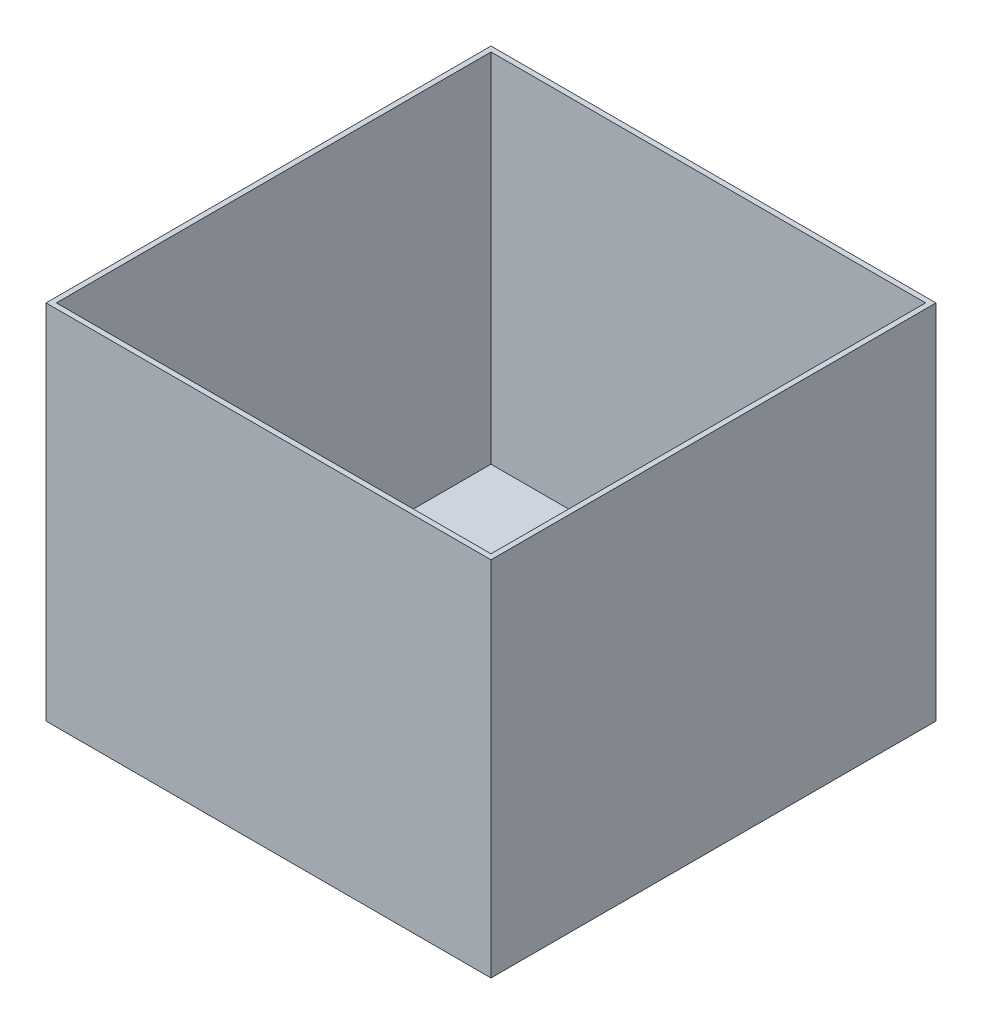
ISO-10303-21;
HEADER;
FILE_DESCRIPTION(('STEP AP214'),'2;1');
FILE_NAME('part.step','',(''),(''),'','','');
FILE_SCHEMA(('AUTOMOTIVE_DESIGN { 1 0 10303 214 1 1 1 1 }'));
ENDSEC;
DATA;
#1=APPLICATION_CONTEXT('core data for automotive mechanical design processes');
#2=APPLICATION_PROTOCOL_DEFINITION('international standard','automotive_design',2000,#1);
#3=PRODUCT_CONTEXT('',#1,'mechanical');
#4=PRODUCT('Part','Part','',(#3));
#5=PRODUCT_RELATED_PRODUCT_CATEGORY('part','',(#4));
#6=PRODUCT_DEFINITION_FORMATION('','',#4);
#7=PRODUCT_DEFINITION_CONTEXT('part definition',#1,'design');
#8=PRODUCT_DEFINITION('design','',#6,#7);
#9=PRODUCT_DEFINITION_SHAPE('','',#8);
#10=(LENGTH_UNIT() NAMED_UNIT(*) SI_UNIT(.MILLI.,.METRE.));
#11=(NAMED_UNIT(*) PLANE_ANGLE_UNIT() SI_UNIT($,.RADIAN.));
#12=(NAMED_UNIT(*) SI_UNIT($,.STERADIAN.) SOLID_ANGLE_UNIT());
#13=UNCERTAINTY_MEASURE_WITH_UNIT(LENGTH_MEASURE(1.E-05),#10,'distance_accuracy_value','');
#14=(GEOMETRIC_REPRESENTATION_CONTEXT(3) GLOBAL_UNCERTAINTY_ASSIGNED_CONTEXT((#13)) GLOBAL_UNIT_ASSIGNED_CONTEXT((#10,
#11,#12)) REPRESENTATION_CONTEXT('',''));
#15=CARTESIAN_POINT('',(0.,0.,0.));
#16=DIRECTION('',(0.,0.,1.));
#17=DIRECTION('',(1.,0.,0.));
#18=AXIS2_PLACEMENT_3D('',#15,#16,#17);
#19=CARTESIAN_POINT('',(0.,-55.,0.));
#20=DIRECTION('',(0.,1.,0.));
#21=DIRECTION('',(0.,0.,1.));
#22=AXIS2_PLACEMENT_3D('',#19,#20,#21);
#23=PLANE('',#22);
#24=DIRECTION('',(0.,0.,1.));
#25=VECTOR('',#24,1.);
#26=CARTESIAN_POINT('',(-215.,-55.,-215.));
#27=LINE('',#26,#25);
#28=CARTESIAN_POINT('',(-215.,-55.,-215.));
#29=VERTEX_POINT('',#28);
#30=CARTESIAN_POINT('',(-215.,-55.,215.));
#31=VERTEX_POINT('',#30);
#32=EDGE_CURVE('E138',#29,#31,#27,.T.);
#33=ORIENTED_EDGE('',*,*,#32,.F.);
#34=DIRECTION('',(-1.,0.,0.));
#35=VECTOR('',#34,1.);
#36=CARTESIAN_POINT('',(215.,-55.,-215.));
#37=LINE('',#36,#35);
#38=CARTESIAN_POINT('',(215.,-55.,-215.));
#39=VERTEX_POINT('',#38);
#40=EDGE_CURVE('E147',#39,#29,#37,.T.);
#41=ORIENTED_EDGE('',*,*,#40,.F.);
#42=DIRECTION('',(0.,0.,-1.));
#43=VECTOR('',#42,1.);
#44=CARTESIAN_POINT('',(215.,-55.,215.));
#45=LINE('',#44,#43);
#46=CARTESIAN_POINT('',(215.,-55.,215.));
#47=VERTEX_POINT('',#46);
#48=EDGE_CURVE('E144',#47,#39,#45,.T.);
#49=ORIENTED_EDGE('',*,*,#48,.F.);
#50=DIRECTION('',(1.,0.,0.));
#51=VECTOR('',#50,1.);
#52=CARTESIAN_POINT('',(-215.,-55.,215.));
#53=LINE('',#52,#51);
#54=EDGE_CURVE('E141',#31,#47,#53,.T.);
#55=ORIENTED_EDGE('',*,*,#54,.F.);
#56=EDGE_LOOP('',(#33,#41,#49,#55));
#57=FACE_BOUND('',#56,.T.);
#58=ADVANCED_FACE('F39',(#57),#23,.F.);
#59=CARTESIAN_POINT('',(-215.,903.111831820433,-215.));
#60=DIRECTION('',(1.,0.,0.));
#61=DIRECTION('',(0.,0.,-1.));
#62=AXIS2_PLACEMENT_3D('',#59,#60,#61);
#63=PLANE('',#62);
#64=DIRECTION('',(0.,-1.,0.));
#65=VECTOR('',#64,1.);
#66=CARTESIAN_POINT('',(-215.,903.111831820433,-215.));
#67=LINE('',#66,#65);
#68=CARTESIAN_POINT('',(-215.000000000001,295.,-215.));
#69=VERTEX_POINT('',#68);
#70=EDGE_CURVE('E150',#69,#29,#67,.T.);
#71=ORIENTED_EDGE('',*,*,#70,.T.);
#72=ORIENTED_EDGE('',*,*,#32,.T.);
#73=DIRECTION('',(0.,-1.,0.));
#74=VECTOR('',#73,1.);
#75=CARTESIAN_POINT('',(-215.,903.111831820433,215.));
#76=LINE('',#75,#74);
#77=CARTESIAN_POINT('',(-215.000000000001,295.,215.));
#78=VERTEX_POINT('',#77);
#79=EDGE_CURVE('E129',#78,#31,#76,.T.);
#80=ORIENTED_EDGE('',*,*,#79,.F.);
#81=DIRECTION('',(0.,0.,-1.));
#82=VECTOR('',#81,1.);
#83=CARTESIAN_POINT('',(-215.,295.,-215.));
#84=LINE('',#83,#82);
#85=EDGE_CURVE('E47',#78,#69,#84,.T.);
#86=ORIENTED_EDGE('',*,*,#85,.T.);
#87=EDGE_LOOP('',(#71,#72,#80,#86));
#88=FACE_BOUND('',#87,.T.);
#89=ADVANCED_FACE('F41',(#88),#63,.F.);
#90=CARTESIAN_POINT('',(-215.,903.111831820433,215.));
#91=DIRECTION('',(0.,0.,-1.));
#92=DIRECTION('',(-1.,0.,0.));
#93=AXIS2_PLACEMENT_3D('',#90,#91,#92);
#94=PLANE('',#93);
#95=ORIENTED_EDGE('',*,*,#79,.T.);
#96=ORIENTED_EDGE('',*,*,#54,.T.);
#97=DIRECTION('',(0.,-1.,0.));
#98=VECTOR('',#97,1.);
#99=CARTESIAN_POINT('',(215.,903.111831820433,215.));
#100=LINE('',#99,#98);
#101=CARTESIAN_POINT('',(214.999999999999,295.000000000002,215.));
#102=VERTEX_POINT('',#101);
#103=EDGE_CURVE('E154',#102,#47,#100,.T.);
#104=ORIENTED_EDGE('',*,*,#103,.F.);
#105=DIRECTION('',(-1.,0.,0.));
#106=VECTOR('',#105,1.);
#107=CARTESIAN_POINT('',(-214.999999999993,295.,215.));
#108=LINE('',#107,#106);
#109=EDGE_CURVE('E163',#102,#78,#108,.T.);
#110=ORIENTED_EDGE('',*,*,#109,.T.);
#111=EDGE_LOOP('',(#95,#96,#104,#110));
#112=FACE_BOUND('',#111,.T.);
#113=ADVANCED_FACE('F180',(#112),#94,.F.);
#114=CARTESIAN_POINT('',(215.,903.111831820433,215.));
#115=DIRECTION('',(-1.,0.,0.));
#116=DIRECTION('',(0.,0.,1.));
#117=AXIS2_PLACEMENT_3D('',#114,#115,#116);
#118=PLANE('',#117);
#119=ORIENTED_EDGE('',*,*,#103,.T.);
#120=ORIENTED_EDGE('',*,*,#48,.T.);
#121=DIRECTION('',(0.,-1.,0.));
#122=VECTOR('',#121,1.);
#123=CARTESIAN_POINT('',(215.,903.111831820433,-215.));
#124=LINE('',#123,#122);
#125=CARTESIAN_POINT('',(215.,295.000000000002,-215.));
#126=VERTEX_POINT('',#125);
#127=EDGE_CURVE('E152',#126,#39,#124,.T.);
#128=ORIENTED_EDGE('',*,*,#127,.F.);
#129=DIRECTION('',(0.,0.,1.));
#130=VECTOR('',#129,1.);
#131=CARTESIAN_POINT('',(215.,295.000000000005,215.));
#132=LINE('',#131,#130);
#133=EDGE_CURVE('E158',#126,#102,#132,.T.);
#134=ORIENTED_EDGE('',*,*,#133,.T.);
#135=EDGE_LOOP('',(#119,#120,#128,#134));
#136=FACE_BOUND('',#135,.T.);
#137=ADVANCED_FACE('F183',(#136),#118,.F.);
#138=CARTESIAN_POINT('',(215.,903.111831820433,-215.));
#139=DIRECTION('',(0.,0.,1.));
#140=DIRECTION('',(1.,0.,0.));
#141=AXIS2_PLACEMENT_3D('',#138,#139,#140);
#142=PLANE('',#141);
#143=ORIENTED_EDGE('',*,*,#127,.T.);
#144=ORIENTED_EDGE('',*,*,#40,.T.);
#145=ORIENTED_EDGE('',*,*,#70,.F.);
#146=DIRECTION('',(1.,0.,0.));
#147=VECTOR('',#146,1.);
#148=CARTESIAN_POINT('',(215.000000000007,295.000000000005,-215.));
#149=LINE('',#148,#147);
#150=EDGE_CURVE('E132',#69,#126,#149,.T.);
#151=ORIENTED_EDGE('',*,*,#150,.T.);
#152=EDGE_LOOP('',(#143,#144,#145,#151));
#153=FACE_BOUND('',#152,.T.);
#154=ADVANCED_FACE('F171',(#153),#142,.F.);
#155=CARTESIAN_POINT('',(210.,903.111831820433,210.));
#156=DIRECTION('',(-1.,0.,0.));
#157=DIRECTION('',(0.,0.,1.));
#158=AXIS2_PLACEMENT_3D('',#155,#156,#157);
#159=PLANE('',#158);
#160=DIRECTION('',(0.,0.,-1.));
#161=VECTOR('',#160,1.);
#162=CARTESIAN_POINT('',(210.,-50.,210.));
#163=LINE('',#162,#161);
#164=CARTESIAN_POINT('',(210.,-50.,210.));
#165=VERTEX_POINT('',#164);
#166=CARTESIAN_POINT('',(210.,-50.,-210.));
#167=VERTEX_POINT('',#166);
#168=EDGE_CURVE('E115',#165,#167,#163,.T.);
#169=ORIENTED_EDGE('',*,*,#168,.F.);
#170=DIRECTION('',(0.,-1.,0.));
#171=VECTOR('',#170,1.);
#172=CARTESIAN_POINT('',(210.,903.111831820433,210.));
#173=LINE('',#172,#171);
#174=CARTESIAN_POINT('',(210.,295.000000000002,210.));
#175=VERTEX_POINT('',#174);
#176=EDGE_CURVE('E107',#175,#165,#173,.T.);
#177=ORIENTED_EDGE('',*,*,#176,.F.);
#178=DIRECTION('',(0.,0.,1.));
#179=VECTOR('',#178,1.);
#180=CARTESIAN_POINT('',(210.,295.000000000005,210.));
#181=LINE('',#180,#179);
#182=CARTESIAN_POINT('',(210.,295.000000000005,-210.));
#183=VERTEX_POINT('',#182);
#184=EDGE_CURVE('E131',#183,#175,#181,.T.);
#185=ORIENTED_EDGE('',*,*,#184,.F.);
#186=DIRECTION('',(0.,-1.,0.));
#187=VECTOR('',#186,1.);
#188=CARTESIAN_POINT('',(210.,903.111831820433,-210.));
#189=LINE('',#188,#187);
#190=EDGE_CURVE('E119',#183,#167,#189,.T.);
#191=ORIENTED_EDGE('',*,*,#190,.T.);
#192=EDGE_LOOP('',(#169,#177,#185,#191));
#193=FACE_BOUND('',#192,.T.);
#194=ADVANCED_FACE('F118',(#193),#159,.T.);
#195=CARTESIAN_POINT('',(210.,903.111831820433,-210.));
#196=DIRECTION('',(0.,0.,1.));
#197=DIRECTION('',(1.,0.,0.));
#198=AXIS2_PLACEMENT_3D('',#195,#196,#197);
#199=PLANE('',#198);
#200=DIRECTION('',(-1.,0.,0.));
#201=VECTOR('',#200,1.);
#202=CARTESIAN_POINT('',(210.,-50.,-210.));
#203=LINE('',#202,#201);
#204=CARTESIAN_POINT('',(-210.,-50.,-210.));
#205=VERTEX_POINT('',#204);
#206=EDGE_CURVE('E54',#167,#205,#203,.T.);
#207=ORIENTED_EDGE('',*,*,#206,.F.);
#208=ORIENTED_EDGE('',*,*,#190,.F.);
#209=DIRECTION('',(1.,0.,0.));
#210=VECTOR('',#209,1.);
#211=CARTESIAN_POINT('',(210.000000000007,295.000000000005,-210.));
#212=LINE('',#211,#210);
#213=CARTESIAN_POINT('',(-210.,295.,-210.));
#214=VERTEX_POINT('',#213);
#215=EDGE_CURVE('E128',#214,#183,#212,.T.);
#216=ORIENTED_EDGE('',*,*,#215,.F.);
#217=DIRECTION('',(0.,-1.,0.));
#218=VECTOR('',#217,1.);
#219=CARTESIAN_POINT('',(-210.,903.111831820433,-210.));
#220=LINE('',#219,#218);
#221=EDGE_CURVE('E135',#214,#205,#220,.T.);
#222=ORIENTED_EDGE('',*,*,#221,.T.);
#223=EDGE_LOOP('',(#207,#208,#216,#222));
#224=FACE_BOUND('',#223,.T.);
#225=ADVANCED_FACE('F199',(#224),#199,.T.);
#226=CARTESIAN_POINT('',(-210.,903.111831820433,-210.));
#227=DIRECTION('',(1.,0.,0.));
#228=DIRECTION('',(0.,0.,-1.));
#229=AXIS2_PLACEMENT_3D('',#226,#227,#228);
#230=PLANE('',#229);
#231=DIRECTION('',(0.,0.,1.));
#232=VECTOR('',#231,1.);
#233=CARTESIAN_POINT('',(-210.,-50.,-210.));
#234=LINE('',#233,#232);
#235=CARTESIAN_POINT('',(-210.,-50.,210.));
#236=VERTEX_POINT('',#235);
#237=EDGE_CURVE('E62',#205,#236,#234,.T.);
#238=ORIENTED_EDGE('',*,*,#237,.F.);
#239=ORIENTED_EDGE('',*,*,#221,.F.);
#240=DIRECTION('',(0.,0.,-1.));
#241=VECTOR('',#240,1.);
#242=CARTESIAN_POINT('',(-210.,295.,-210.));
#243=LINE('',#242,#241);
#244=CARTESIAN_POINT('',(-210.,295.,210.));
#245=VERTEX_POINT('',#244);
#246=EDGE_CURVE('E126',#245,#214,#243,.T.);
#247=ORIENTED_EDGE('',*,*,#246,.F.);
#248=DIRECTION('',(0.,-1.,0.));
#249=VECTOR('',#248,1.);
#250=CARTESIAN_POINT('',(-210.,903.111831820433,210.));
#251=LINE('',#250,#249);
#252=EDGE_CURVE('E114',#245,#236,#251,.T.);
#253=ORIENTED_EDGE('',*,*,#252,.T.);
#254=EDGE_LOOP('',(#238,#239,#247,#253));
#255=FACE_BOUND('',#254,.T.);
#256=ADVANCED_FACE('F202',(#255),#230,.T.);
#257=CARTESIAN_POINT('',(-210.,903.111831820433,210.));
#258=DIRECTION('',(0.,0.,-1.));
#259=DIRECTION('',(-1.,0.,0.));
#260=AXIS2_PLACEMENT_3D('',#257,#258,#259);
#261=PLANE('',#260);
#262=DIRECTION('',(1.,0.,0.));
#263=VECTOR('',#262,1.);
#264=CARTESIAN_POINT('',(-210.,-50.,210.));
#265=LINE('',#264,#263);
#266=EDGE_CURVE('E11',#236,#165,#265,.T.);
#267=ORIENTED_EDGE('',*,*,#266,.F.);
#268=ORIENTED_EDGE('',*,*,#252,.F.);
#269=DIRECTION('',(-1.,0.,0.));
#270=VECTOR('',#269,1.);
#271=CARTESIAN_POINT('',(-209.999999999993,295.,210.));
#272=LINE('',#271,#270);
#273=EDGE_CURVE('E111',#175,#245,#272,.T.);
#274=ORIENTED_EDGE('',*,*,#273,.F.);
#275=ORIENTED_EDGE('',*,*,#176,.T.);
#276=EDGE_LOOP('',(#267,#268,#274,#275));
#277=FACE_BOUND('',#276,.T.);
#278=ADVANCED_FACE('F109',(#277),#261,.T.);
#279=CARTESIAN_POINT('',(-3.27515792264422E-12,295.000000000002,0.));
#280=DIRECTION('',(0.,-1.,0.));
#281=DIRECTION('',(1.,0.,0.));
#282=AXIS2_PLACEMENT_3D('',#279,#280,#281);
#283=PLANE('',#282);
#284=ORIENTED_EDGE('',*,*,#184,.T.);
#285=ORIENTED_EDGE('',*,*,#273,.T.);
#286=ORIENTED_EDGE('',*,*,#246,.T.);
#287=ORIENTED_EDGE('',*,*,#215,.T.);
#288=EDGE_LOOP('',(#284,#285,#286,#287));
#289=FACE_BOUND('',#288,.T.);
#290=ORIENTED_EDGE('',*,*,#150,.F.);
#291=ORIENTED_EDGE('',*,*,#85,.F.);
#292=ORIENTED_EDGE('',*,*,#109,.F.);
#293=ORIENTED_EDGE('',*,*,#133,.F.);
#294=EDGE_LOOP('',(#290,#291,#292,#293));
#295=FACE_BOUND('',#294,.T.);
#296=ADVANCED_FACE('F181',(#289,#295),#283,.F.);
#297=CARTESIAN_POINT('',(0.,-50.,0.));
#298=DIRECTION('',(0.,1.,0.));
#299=DIRECTION('',(0.,0.,1.));
#300=AXIS2_PLACEMENT_3D('',#297,#298,#299);
#301=PLANE('',#300);
#302=ORIENTED_EDGE('',*,*,#266,.T.);
#303=ORIENTED_EDGE('',*,*,#168,.T.);
#304=ORIENTED_EDGE('',*,*,#206,.T.);
#305=ORIENTED_EDGE('',*,*,#237,.T.);
#306=EDGE_LOOP('',(#302,#303,#304,#305));
#307=FACE_BOUND('',#306,.T.);
#308=ADVANCED_FACE('F122',(#307),#301,.T.);
#309=CLOSED_SHELL('',(#58,#89,#113,#137,#154,#194,#225,#256,#278,#296,#308));
#310=MANIFOLD_SOLID_BREP('B2',#309);
#311=ADVANCED_BREP_SHAPE_REPRESENTATION('',(#18,#310),#14);
#312=SHAPE_DEFINITION_REPRESENTATION(#9,#311);
ENDSEC;
END-ISO-10303-21;
